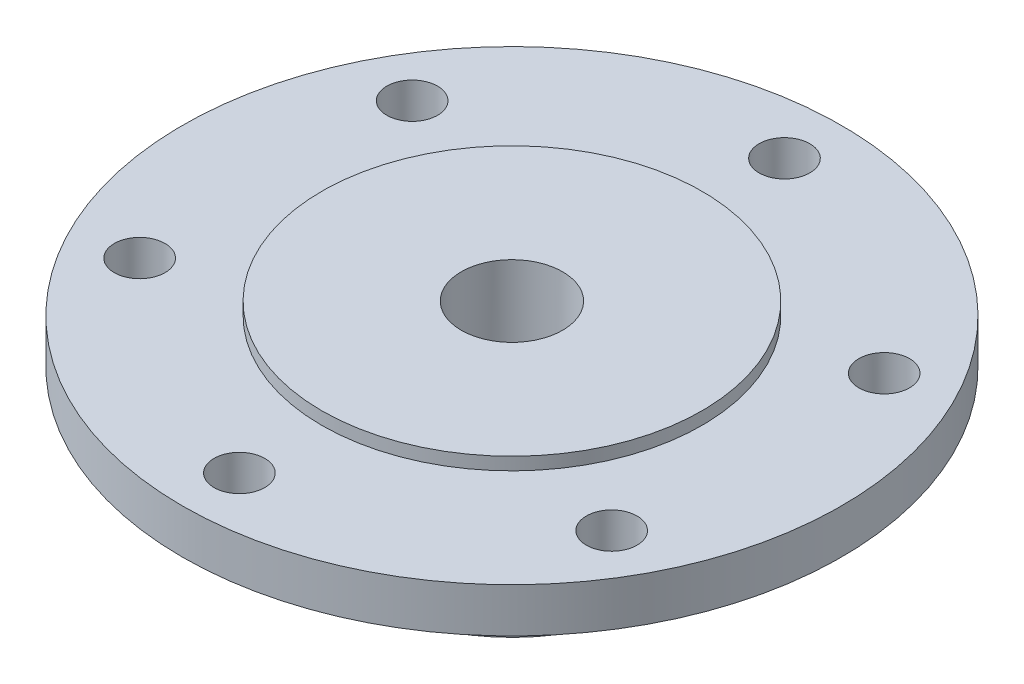
ISO-10303-21;
HEADER;
FILE_DESCRIPTION(('STEP AP214'),'2;1');
FILE_NAME('part.step','',(''),(''),'','','');
FILE_SCHEMA(('AUTOMOTIVE_DESIGN { 1 0 10303 214 1 1 1 1 }'));
ENDSEC;
DATA;
#1=APPLICATION_CONTEXT('core data for automotive mechanical design processes');
#2=APPLICATION_PROTOCOL_DEFINITION('international standard','automotive_design',2000,#1);
#3=PRODUCT_CONTEXT('',#1,'mechanical');
#4=PRODUCT('Part','Part','',(#3));
#5=PRODUCT_RELATED_PRODUCT_CATEGORY('part','',(#4));
#6=PRODUCT_DEFINITION_FORMATION('','',#4);
#7=PRODUCT_DEFINITION_CONTEXT('part definition',#1,'design');
#8=PRODUCT_DEFINITION('design','',#6,#7);
#9=PRODUCT_DEFINITION_SHAPE('','',#8);
#10=(LENGTH_UNIT() NAMED_UNIT(*) SI_UNIT(.MILLI.,.METRE.));
#11=(NAMED_UNIT(*) PLANE_ANGLE_UNIT() SI_UNIT($,.RADIAN.));
#12=(NAMED_UNIT(*) SI_UNIT($,.STERADIAN.) SOLID_ANGLE_UNIT());
#13=UNCERTAINTY_MEASURE_WITH_UNIT(LENGTH_MEASURE(1.E-05),#10,'distance_accuracy_value','');
#14=(GEOMETRIC_REPRESENTATION_CONTEXT(3) GLOBAL_UNCERTAINTY_ASSIGNED_CONTEXT((#13)) GLOBAL_UNIT_ASSIGNED_CONTEXT((#10,
#11,#12)) REPRESENTATION_CONTEXT('',''));
#15=CARTESIAN_POINT('',(0.,0.,0.));
#16=DIRECTION('',(0.,0.,1.));
#17=DIRECTION('',(1.,0.,0.));
#18=AXIS2_PLACEMENT_3D('',#15,#16,#17);
#19=CARTESIAN_POINT('',(0.,7.25,0.));
#20=DIRECTION('',(0.,-1.,0.));
#21=DIRECTION('',(0.,0.,-1.));
#22=AXIS2_PLACEMENT_3D('',#19,#20,#21);
#23=PLANE('',#22);
#24=CARTESIAN_POINT('',(0.,7.25,0.));
#25=DIRECTION('',(0.,1.,0.));
#26=DIRECTION('',(0.,0.,1.));
#27=AXIS2_PLACEMENT_3D('',#24,#25,#26);
#28=CIRCLE('',#27,4.);
#29=CARTESIAN_POINT('',(0.,7.25,4.));
#30=VERTEX_POINT('',#29);
#31=EDGE_CURVE('E60',#30,#30,#28,.T.);
#32=ORIENTED_EDGE('',*,*,#31,.F.);
#33=EDGE_LOOP('',(#32));
#34=FACE_BOUND('',#33,.T.);
#35=CARTESIAN_POINT('',(0.,7.25,0.));
#36=DIRECTION('',(0.,1.,0.));
#37=DIRECTION('',(0.,0.,1.));
#38=AXIS2_PLACEMENT_3D('',#35,#36,#37);
#39=CIRCLE('',#38,15.);
#40=CARTESIAN_POINT('',(0.,7.25,15.));
#41=VERTEX_POINT('',#40);
#42=EDGE_CURVE('E10',#41,#41,#39,.T.);
#43=ORIENTED_EDGE('',*,*,#42,.T.);
#44=EDGE_LOOP('',(#43));
#45=FACE_BOUND('',#44,.T.);
#46=ADVANCED_FACE('F40',(#34,#45),#23,.F.);
#47=CARTESIAN_POINT('',(0.,11.2335164835165,0.));
#48=DIRECTION('',(0.,1.,0.));
#49=DIRECTION('',(0.,0.,1.));
#50=AXIS2_PLACEMENT_3D('',#47,#48,#49);
#51=CYLINDRICAL_SURFACE('',#50,15.);
#52=ORIENTED_EDGE('',*,*,#42,.F.);
#53=EDGE_LOOP('',(#52));
#54=FACE_BOUND('',#53,.T.);
#55=CARTESIAN_POINT('',(0.,6.25,0.));
#56=DIRECTION('',(0.,1.,0.));
#57=DIRECTION('',(0.,0.,1.));
#58=AXIS2_PLACEMENT_3D('',#55,#56,#57);
#59=CIRCLE('',#58,15.);
#60=CARTESIAN_POINT('',(0.,6.25,15.));
#61=VERTEX_POINT('',#60);
#62=EDGE_CURVE('E42',#61,#61,#59,.T.);
#63=ORIENTED_EDGE('',*,*,#62,.T.);
#64=EDGE_LOOP('',(#63));
#65=FACE_BOUND('',#64,.T.);
#66=ADVANCED_FACE('F141',(#54,#65),#51,.T.);
#67=CARTESIAN_POINT('',(15.,6.25,0.));
#68=DIRECTION('',(0.,-1.,0.));
#69=DIRECTION('',(0.,0.,-1.));
#70=AXIS2_PLACEMENT_3D('',#67,#68,#69);
#71=PLANE('',#70);
#72=CARTESIAN_POINT('',(-18.6195461813656,6.25,-10.7499999999998));
#73=DIRECTION('',(0.,-1.,0.));
#74=DIRECTION('',(0.,0.,-1.));
#75=AXIS2_PLACEMENT_3D('',#72,#73,#74);
#76=CIRCLE('',#75,2.);
#77=CARTESIAN_POINT('',(-18.6195461813656,6.25,-12.7499999999998));
#78=VERTEX_POINT('',#77);
#79=EDGE_CURVE('E87',#78,#78,#76,.T.);
#80=ORIENTED_EDGE('',*,*,#79,.T.);
#81=EDGE_LOOP('',(#80));
#82=FACE_BOUND('',#81,.T.);
#83=CARTESIAN_POINT('',(-2.25514051876985E-13,6.25,-21.5));
#84=DIRECTION('',(0.,-1.,0.));
#85=DIRECTION('',(0.,0.,-1.));
#86=AXIS2_PLACEMENT_3D('',#83,#84,#85);
#87=CIRCLE('',#86,2.);
#88=CARTESIAN_POINT('',(-2.25514051876985E-13,6.25,-23.5));
#89=VERTEX_POINT('',#88);
#90=EDGE_CURVE('E73',#89,#89,#87,.T.);
#91=ORIENTED_EDGE('',*,*,#90,.T.);
#92=EDGE_LOOP('',(#91));
#93=FACE_BOUND('',#92,.T.);
#94=CARTESIAN_POINT('',(18.6195461813653,6.25,-10.7500000000001));
#95=DIRECTION('',(0.,-1.,0.));
#96=DIRECTION('',(0.,0.,-1.));
#97=AXIS2_PLACEMENT_3D('',#94,#95,#96);
#98=CIRCLE('',#97,2.);
#99=CARTESIAN_POINT('',(18.6195461813653,6.25,-12.7500000000001));
#100=VERTEX_POINT('',#99);
#101=EDGE_CURVE('E75',#100,#100,#98,.T.);
#102=ORIENTED_EDGE('',*,*,#101,.T.);
#103=EDGE_LOOP('',(#102));
#104=FACE_BOUND('',#103,.T.);
#105=CARTESIAN_POINT('',(18.6195461813655,6.25,10.7499999999999));
#106=DIRECTION('',(0.,-1.,0.));
#107=DIRECTION('',(0.,0.,-1.));
#108=AXIS2_PLACEMENT_3D('',#105,#106,#107);
#109=CIRCLE('',#108,2.);
#110=CARTESIAN_POINT('',(18.6195461813655,6.25,8.74999999999989));
#111=VERTEX_POINT('',#110);
#112=EDGE_CURVE('E66',#111,#111,#109,.T.);
#113=ORIENTED_EDGE('',*,*,#112,.T.);
#114=EDGE_LOOP('',(#113));
#115=FACE_BOUND('',#114,.T.);
#116=CARTESIAN_POINT('',(0.,6.25,21.5));
#117=DIRECTION('',(0.,-1.,0.));
#118=DIRECTION('',(0.,0.,-1.));
#119=AXIS2_PLACEMENT_3D('',#116,#117,#118);
#120=CIRCLE('',#119,2.);
#121=CARTESIAN_POINT('',(0.,6.25,19.5));
#122=VERTEX_POINT('',#121);
#123=EDGE_CURVE('E63',#122,#122,#120,.T.);
#124=ORIENTED_EDGE('',*,*,#123,.T.);
#125=EDGE_LOOP('',(#124));
#126=FACE_BOUND('',#125,.T.);
#127=CARTESIAN_POINT('',(-18.6195461813654,6.25,10.75));
#128=DIRECTION('',(0.,-1.,0.));
#129=DIRECTION('',(0.,0.,-1.));
#130=AXIS2_PLACEMENT_3D('',#127,#128,#129);
#131=CIRCLE('',#130,2.);
#132=CARTESIAN_POINT('',(-18.6195461813654,6.25,8.75000000000002));
#133=VERTEX_POINT('',#132);
#134=EDGE_CURVE('E62',#133,#133,#131,.T.);
#135=ORIENTED_EDGE('',*,*,#134,.T.);
#136=EDGE_LOOP('',(#135));
#137=FACE_BOUND('',#136,.T.);
#138=ORIENTED_EDGE('',*,*,#62,.F.);
#139=EDGE_LOOP('',(#138));
#140=FACE_BOUND('',#139,.T.);
#141=CARTESIAN_POINT('',(0.,6.25,0.));
#142=DIRECTION('',(0.,1.,0.));
#143=DIRECTION('',(0.,0.,1.));
#144=AXIS2_PLACEMENT_3D('',#141,#142,#143);
#145=CIRCLE('',#144,26.);
#146=CARTESIAN_POINT('',(0.,6.25,26.));
#147=VERTEX_POINT('',#146);
#148=EDGE_CURVE('E47',#147,#147,#145,.T.);
#149=ORIENTED_EDGE('',*,*,#148,.T.);
#150=EDGE_LOOP('',(#149));
#151=FACE_BOUND('',#150,.T.);
#152=ADVANCED_FACE('F107',(#82,#93,#104,#115,#126,#137,#140,#151),#71,.F.);
#153=CARTESIAN_POINT('',(0.,11.2335164835165,0.));
#154=DIRECTION('',(0.,1.,0.));
#155=DIRECTION('',(0.,0.,1.));
#156=AXIS2_PLACEMENT_3D('',#153,#154,#155);
#157=CYLINDRICAL_SURFACE('',#156,26.);
#158=ORIENTED_EDGE('',*,*,#148,.F.);
#159=EDGE_LOOP('',(#158));
#160=FACE_BOUND('',#159,.T.);
#161=CARTESIAN_POINT('',(0.,2.75,0.));
#162=DIRECTION('',(0.,1.,0.));
#163=DIRECTION('',(0.,0.,1.));
#164=AXIS2_PLACEMENT_3D('',#161,#162,#163);
#165=CIRCLE('',#164,26.);
#166=CARTESIAN_POINT('',(0.,2.75,26.));
#167=VERTEX_POINT('',#166);
#168=EDGE_CURVE('E103',#167,#167,#165,.T.);
#169=ORIENTED_EDGE('',*,*,#168,.T.);
#170=EDGE_LOOP('',(#169));
#171=FACE_BOUND('',#170,.T.);
#172=ADVANCED_FACE('F109',(#160,#171),#157,.T.);
#173=CARTESIAN_POINT('',(26.,2.75,0.));
#174=DIRECTION('',(0.,1.,0.));
#175=DIRECTION('',(0.,0.,1.));
#176=AXIS2_PLACEMENT_3D('',#173,#174,#175);
#177=PLANE('',#176);
#178=CARTESIAN_POINT('',(-18.6195461813656,2.75,-10.7499999999998));
#179=DIRECTION('',(0.,1.,0.));
#180=DIRECTION('',(0.,0.,1.));
#181=AXIS2_PLACEMENT_3D('',#178,#179,#180);
#182=CIRCLE('',#181,2.);
#183=CARTESIAN_POINT('',(-18.6195461813656,2.75,-8.74999999999976));
#184=VERTEX_POINT('',#183);
#185=EDGE_CURVE('E37',#184,#184,#182,.T.);
#186=ORIENTED_EDGE('',*,*,#185,.T.);
#187=EDGE_LOOP('',(#186));
#188=FACE_BOUND('',#187,.T.);
#189=CARTESIAN_POINT('',(-2.25514051876985E-13,2.75,-21.5));
#190=DIRECTION('',(0.,1.,0.));
#191=DIRECTION('',(0.,0.,1.));
#192=AXIS2_PLACEMENT_3D('',#189,#190,#191);
#193=CIRCLE('',#192,2.);
#194=CARTESIAN_POINT('',(-2.25514051876985E-13,2.75,-19.5));
#195=VERTEX_POINT('',#194);
#196=EDGE_CURVE('E71',#195,#195,#193,.T.);
#197=ORIENTED_EDGE('',*,*,#196,.T.);
#198=EDGE_LOOP('',(#197));
#199=FACE_BOUND('',#198,.T.);
#200=CARTESIAN_POINT('',(18.6195461813653,2.75,-10.7500000000001));
#201=DIRECTION('',(0.,1.,0.));
#202=DIRECTION('',(0.,0.,1.));
#203=AXIS2_PLACEMENT_3D('',#200,#201,#202);
#204=CIRCLE('',#203,2.);
#205=CARTESIAN_POINT('',(18.6195461813653,2.75,-8.75000000000015));
#206=VERTEX_POINT('',#205);
#207=EDGE_CURVE('E68',#206,#206,#204,.T.);
#208=ORIENTED_EDGE('',*,*,#207,.T.);
#209=EDGE_LOOP('',(#208));
#210=FACE_BOUND('',#209,.T.);
#211=CARTESIAN_POINT('',(18.6195461813655,2.75,10.7499999999999));
#212=DIRECTION('',(0.,1.,0.));
#213=DIRECTION('',(0.,0.,1.));
#214=AXIS2_PLACEMENT_3D('',#211,#212,#213);
#215=CIRCLE('',#214,2.);
#216=CARTESIAN_POINT('',(18.6195461813655,2.75,12.7499999999999));
#217=VERTEX_POINT('',#216);
#218=EDGE_CURVE('E67',#217,#217,#215,.T.);
#219=ORIENTED_EDGE('',*,*,#218,.T.);
#220=EDGE_LOOP('',(#219));
#221=FACE_BOUND('',#220,.T.);
#222=CARTESIAN_POINT('',(0.,2.75,21.5));
#223=DIRECTION('',(0.,1.,0.));
#224=DIRECTION('',(0.,0.,1.));
#225=AXIS2_PLACEMENT_3D('',#222,#223,#224);
#226=CIRCLE('',#225,2.);
#227=CARTESIAN_POINT('',(0.,2.75,23.5));
#228=VERTEX_POINT('',#227);
#229=EDGE_CURVE('E65',#228,#228,#226,.T.);
#230=ORIENTED_EDGE('',*,*,#229,.T.);
#231=EDGE_LOOP('',(#230));
#232=FACE_BOUND('',#231,.T.);
#233=CARTESIAN_POINT('',(-18.6195461813654,2.75,10.75));
#234=DIRECTION('',(0.,1.,0.));
#235=DIRECTION('',(0.,0.,1.));
#236=AXIS2_PLACEMENT_3D('',#233,#234,#235);
#237=CIRCLE('',#236,2.);
#238=CARTESIAN_POINT('',(-18.6195461813654,2.75,12.75));
#239=VERTEX_POINT('',#238);
#240=EDGE_CURVE('E59',#239,#239,#237,.T.);
#241=ORIENTED_EDGE('',*,*,#240,.T.);
#242=EDGE_LOOP('',(#241));
#243=FACE_BOUND('',#242,.T.);
#244=ORIENTED_EDGE('',*,*,#168,.F.);
#245=EDGE_LOOP('',(#244));
#246=FACE_BOUND('',#245,.T.);
#247=CARTESIAN_POINT('',(0.,2.75,0.));
#248=DIRECTION('',(0.,1.,0.));
#249=DIRECTION('',(0.,0.,1.));
#250=AXIS2_PLACEMENT_3D('',#247,#248,#249);
#251=CIRCLE('',#250,12.);
#252=CARTESIAN_POINT('',(0.,2.75,12.));
#253=VERTEX_POINT('',#252);
#254=EDGE_CURVE('E99',#253,#253,#251,.T.);
#255=ORIENTED_EDGE('',*,*,#254,.T.);
#256=EDGE_LOOP('',(#255));
#257=FACE_BOUND('',#256,.T.);
#258=ADVANCED_FACE('F114',(#188,#199,#210,#221,#232,#243,#246,#257),#177,.F.);
#259=CARTESIAN_POINT('',(0.,11.2335164835165,0.));
#260=DIRECTION('',(0.,1.,0.));
#261=DIRECTION('',(0.,0.,1.));
#262=AXIS2_PLACEMENT_3D('',#259,#260,#261);
#263=CYLINDRICAL_SURFACE('',#262,12.);
#264=ORIENTED_EDGE('',*,*,#254,.F.);
#265=EDGE_LOOP('',(#264));
#266=FACE_BOUND('',#265,.T.);
#267=CARTESIAN_POINT('',(0.,-7.25,0.));
#268=DIRECTION('',(0.,1.,0.));
#269=DIRECTION('',(0.,0.,1.));
#270=AXIS2_PLACEMENT_3D('',#267,#268,#269);
#271=CIRCLE('',#270,12.);
#272=CARTESIAN_POINT('',(0.,-7.25,12.));
#273=VERTEX_POINT('',#272);
#274=EDGE_CURVE('E100',#273,#273,#271,.T.);
#275=ORIENTED_EDGE('',*,*,#274,.T.);
#276=EDGE_LOOP('',(#275));
#277=FACE_BOUND('',#276,.T.);
#278=ADVANCED_FACE('F116',(#266,#277),#263,.T.);
#279=CARTESIAN_POINT('',(0.,-7.25,0.));
#280=DIRECTION('',(0.,1.,0.));
#281=DIRECTION('',(0.,0.,1.));
#282=AXIS2_PLACEMENT_3D('',#279,#280,#281);
#283=PLANE('',#282);
#284=CARTESIAN_POINT('',(0.,-7.25,0.));
#285=DIRECTION('',(0.,-1.,0.));
#286=DIRECTION('',(0.,0.,-1.));
#287=AXIS2_PLACEMENT_3D('',#284,#285,#286);
#288=CIRCLE('',#287,6.);
#289=CARTESIAN_POINT('',(0.,-7.25,-6.));
#290=VERTEX_POINT('',#289);
#291=EDGE_CURVE('E57',#290,#290,#288,.T.);
#292=ORIENTED_EDGE('',*,*,#291,.F.);
#293=EDGE_LOOP('',(#292));
#294=FACE_BOUND('',#293,.T.);
#295=ORIENTED_EDGE('',*,*,#274,.F.);
#296=EDGE_LOOP('',(#295));
#297=FACE_BOUND('',#296,.T.);
#298=ADVANCED_FACE('F127',(#294,#297),#283,.F.);
#299=CARTESIAN_POINT('',(0.,0.144836285834636,0.));
#300=DIRECTION('',(0.,-1.,0.));
#301=DIRECTION('',(0.,0.,-1.));
#302=AXIS2_PLACEMENT_3D('',#299,#300,#301);
#303=CONICAL_SURFACE('',#302,6.,1.02974425867665);
#304=CARTESIAN_POINT('',(0.,1.34655752388976,0.));
#305=DIRECTION('',(0.,-1.,0.));
#306=DIRECTION('',(0.,0.,-1.));
#307=AXIS2_PLACEMENT_3D('',#304,#305,#306);
#308=CIRCLE('',#307,4.);
#309=CARTESIAN_POINT('',(0.,1.34655752388976,-4.));
#310=VERTEX_POINT('',#309);
#311=EDGE_CURVE('E52',#310,#310,#308,.F.);
#312=ORIENTED_EDGE('',*,*,#311,.T.);
#313=EDGE_LOOP('',(#312));
#314=FACE_BOUND('',#313,.T.);
#315=CARTESIAN_POINT('',(0.,0.144836285834636,0.));
#316=DIRECTION('',(0.,-1.,0.));
#317=DIRECTION('',(0.,0.,-1.));
#318=AXIS2_PLACEMENT_3D('',#315,#316,#317);
#319=CIRCLE('',#318,6.);
#320=CARTESIAN_POINT('',(0.,0.144836285834636,-6.));
#321=VERTEX_POINT('',#320);
#322=EDGE_CURVE('E94',#321,#321,#319,.T.);
#323=ORIENTED_EDGE('',*,*,#322,.T.);
#324=EDGE_LOOP('',(#323));
#325=FACE_BOUND('',#324,.T.);
#326=ADVANCED_FACE('F132',(#314,#325),#303,.F.);
#327=CARTESIAN_POINT('',(0.,-7.25,0.));
#328=DIRECTION('',(0.,-1.,0.));
#329=DIRECTION('',(0.,0.,-1.));
#330=AXIS2_PLACEMENT_3D('',#327,#328,#329);
#331=CYLINDRICAL_SURFACE('',#330,6.);
#332=ORIENTED_EDGE('',*,*,#322,.F.);
#333=EDGE_LOOP('',(#332));
#334=FACE_BOUND('',#333,.T.);
#335=ORIENTED_EDGE('',*,*,#291,.T.);
#336=EDGE_LOOP('',(#335));
#337=FACE_BOUND('',#336,.T.);
#338=ADVANCED_FACE('F140',(#334,#337),#331,.F.);
#339=CARTESIAN_POINT('',(0.,-7.25,0.));
#340=DIRECTION('',(0.,1.,0.));
#341=DIRECTION('',(0.,0.,1.));
#342=AXIS2_PLACEMENT_3D('',#339,#340,#341);
#343=CYLINDRICAL_SURFACE('',#342,4.);
#344=ORIENTED_EDGE('',*,*,#31,.T.);
#345=EDGE_LOOP('',(#344));
#346=FACE_BOUND('',#345,.T.);
#347=ORIENTED_EDGE('',*,*,#311,.F.);
#348=EDGE_LOOP('',(#347));
#349=FACE_BOUND('',#348,.T.);
#350=ADVANCED_FACE('F151',(#346,#349),#343,.F.);
#351=CARTESIAN_POINT('',(-18.6195461813654,7.25,10.75));
#352=DIRECTION('',(0.,-1.,0.));
#353=DIRECTION('',(0.,0.,-1.));
#354=AXIS2_PLACEMENT_3D('',#351,#352,#353);
#355=CYLINDRICAL_SURFACE('',#354,2.);
#356=ORIENTED_EDGE('',*,*,#240,.F.);
#357=EDGE_LOOP('',(#356));
#358=FACE_BOUND('',#357,.T.);
#359=ORIENTED_EDGE('',*,*,#134,.F.);
#360=EDGE_LOOP('',(#359));
#361=FACE_BOUND('',#360,.T.);
#362=ADVANCED_FACE('F152',(#358,#361),#355,.F.);
#363=CARTESIAN_POINT('',(0.,7.25,21.5));
#364=DIRECTION('',(0.,-1.,0.));
#365=DIRECTION('',(0.,0.,-1.));
#366=AXIS2_PLACEMENT_3D('',#363,#364,#365);
#367=CYLINDRICAL_SURFACE('',#366,2.);
#368=ORIENTED_EDGE('',*,*,#229,.F.);
#369=EDGE_LOOP('',(#368));
#370=FACE_BOUND('',#369,.T.);
#371=ORIENTED_EDGE('',*,*,#123,.F.);
#372=EDGE_LOOP('',(#371));
#373=FACE_BOUND('',#372,.T.);
#374=ADVANCED_FACE('F170',(#370,#373),#367,.F.);
#375=CARTESIAN_POINT('',(18.6195461813655,7.25,10.7499999999999));
#376=DIRECTION('',(0.,-1.,0.));
#377=DIRECTION('',(0.,0.,-1.));
#378=AXIS2_PLACEMENT_3D('',#375,#376,#377);
#379=CYLINDRICAL_SURFACE('',#378,2.);
#380=ORIENTED_EDGE('',*,*,#218,.F.);
#381=EDGE_LOOP('',(#380));
#382=FACE_BOUND('',#381,.T.);
#383=ORIENTED_EDGE('',*,*,#112,.F.);
#384=EDGE_LOOP('',(#383));
#385=FACE_BOUND('',#384,.T.);
#386=ADVANCED_FACE('F178',(#382,#385),#379,.F.);
#387=CARTESIAN_POINT('',(18.6195461813653,7.25,-10.7500000000001));
#388=DIRECTION('',(0.,-1.,0.));
#389=DIRECTION('',(0.,0.,-1.));
#390=AXIS2_PLACEMENT_3D('',#387,#388,#389);
#391=CYLINDRICAL_SURFACE('',#390,2.);
#392=ORIENTED_EDGE('',*,*,#207,.F.);
#393=EDGE_LOOP('',(#392));
#394=FACE_BOUND('',#393,.T.);
#395=ORIENTED_EDGE('',*,*,#101,.F.);
#396=EDGE_LOOP('',(#395));
#397=FACE_BOUND('',#396,.T.);
#398=ADVANCED_FACE('F177',(#394,#397),#391,.F.);
#399=CARTESIAN_POINT('',(-2.25514051876985E-13,7.25,-21.5));
#400=DIRECTION('',(0.,-1.,0.));
#401=DIRECTION('',(0.,0.,-1.));
#402=AXIS2_PLACEMENT_3D('',#399,#400,#401);
#403=CYLINDRICAL_SURFACE('',#402,2.);
#404=ORIENTED_EDGE('',*,*,#196,.F.);
#405=EDGE_LOOP('',(#404));
#406=FACE_BOUND('',#405,.T.);
#407=ORIENTED_EDGE('',*,*,#90,.F.);
#408=EDGE_LOOP('',(#407));
#409=FACE_BOUND('',#408,.T.);
#410=ADVANCED_FACE('F175',(#406,#409),#403,.F.);
#411=CARTESIAN_POINT('',(-18.6195461813656,7.25,-10.7499999999998));
#412=DIRECTION('',(0.,-1.,0.));
#413=DIRECTION('',(0.,0.,-1.));
#414=AXIS2_PLACEMENT_3D('',#411,#412,#413);
#415=CYLINDRICAL_SURFACE('',#414,2.);
#416=ORIENTED_EDGE('',*,*,#185,.F.);
#417=EDGE_LOOP('',(#416));
#418=FACE_BOUND('',#417,.T.);
#419=ORIENTED_EDGE('',*,*,#79,.F.);
#420=EDGE_LOOP('',(#419));
#421=FACE_BOUND('',#420,.T.);
#422=ADVANCED_FACE('F166',(#418,#421),#415,.F.);
#423=CLOSED_SHELL('',(#46,#66,#152,#172,#258,#278,#298,#326,#338,#350,#362,#374,#386,#398,#410,#422));
#424=MANIFOLD_SOLID_BREP('B2',#423);
#425=ADVANCED_BREP_SHAPE_REPRESENTATION('',(#18,#424),#14);
#426=SHAPE_DEFINITION_REPRESENTATION(#9,#425);
ENDSEC;
END-ISO-10303-21;
